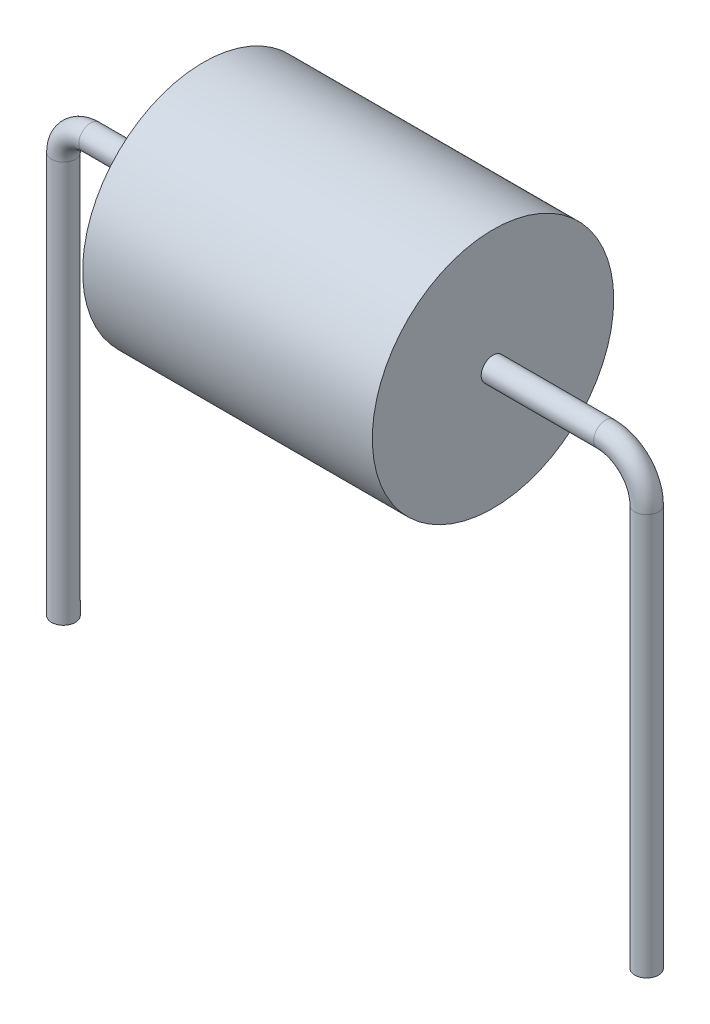
ISO-10303-21;
HEADER;
FILE_DESCRIPTION(('STEP AP214'),'2;1');
FILE_NAME('part.step','',(''),(''),'','','');
FILE_SCHEMA(('AUTOMOTIVE_DESIGN { 1 0 10303 214 1 1 1 1 }'));
ENDSEC;
DATA;
#1=APPLICATION_CONTEXT('core data for automotive mechanical design processes');
#2=APPLICATION_PROTOCOL_DEFINITION('international standard','automotive_design',2000,#1);
#3=PRODUCT_CONTEXT('',#1,'mechanical');
#4=PRODUCT('Part','Part','',(#3));
#5=PRODUCT_RELATED_PRODUCT_CATEGORY('part','',(#4));
#6=PRODUCT_DEFINITION_FORMATION('','',#4);
#7=PRODUCT_DEFINITION_CONTEXT('part definition',#1,'design');
#8=PRODUCT_DEFINITION('design','',#6,#7);
#9=PRODUCT_DEFINITION_SHAPE('','',#8);
#10=(LENGTH_UNIT() NAMED_UNIT(*) SI_UNIT(.MILLI.,.METRE.));
#11=(NAMED_UNIT(*) PLANE_ANGLE_UNIT() SI_UNIT($,.RADIAN.));
#12=(NAMED_UNIT(*) SI_UNIT($,.STERADIAN.) SOLID_ANGLE_UNIT());
#13=UNCERTAINTY_MEASURE_WITH_UNIT(LENGTH_MEASURE(1.E-05),#10,'distance_accuracy_value','');
#14=(GEOMETRIC_REPRESENTATION_CONTEXT(3) GLOBAL_UNCERTAINTY_ASSIGNED_CONTEXT((#13)) GLOBAL_UNIT_ASSIGNED_CONTEXT((#10,
#11,#12)) REPRESENTATION_CONTEXT('',''));
#15=CARTESIAN_POINT('',(0.,0.,0.));
#16=DIRECTION('',(0.,0.,1.));
#17=DIRECTION('',(1.,0.,0.));
#18=AXIS2_PLACEMENT_3D('',#15,#16,#17);
#19=CARTESIAN_POINT('',(6.,0.,0.));
#20=DIRECTION('',(-1.,0.,0.));
#21=DIRECTION('',(0.,0.,1.));
#22=AXIS2_PLACEMENT_3D('',#19,#20,#21);
#23=CYLINDRICAL_SURFACE('',#22,2.5);
#24=CARTESIAN_POINT('',(6.,0.,0.));
#25=DIRECTION('',(1.,0.,0.));
#26=DIRECTION('',(0.,0.,-1.));
#27=AXIS2_PLACEMENT_3D('',#24,#25,#26);
#28=CIRCLE('',#27,2.5);
#29=CARTESIAN_POINT('',(6.,0.,-2.5));
#30=VERTEX_POINT('',#29);
#31=EDGE_CURVE('E40',#30,#30,#28,.T.);
#32=ORIENTED_EDGE('',*,*,#31,.F.);
#33=EDGE_LOOP('',(#32));
#34=FACE_BOUND('',#33,.T.);
#35=CARTESIAN_POINT('',(0.,0.,0.));
#36=DIRECTION('',(1.,0.,0.));
#37=DIRECTION('',(0.,0.,-1.));
#38=AXIS2_PLACEMENT_3D('',#35,#36,#37);
#39=CIRCLE('',#38,2.5);
#40=CARTESIAN_POINT('',(0.,0.,-2.5));
#41=VERTEX_POINT('',#40);
#42=EDGE_CURVE('E44',#41,#41,#39,.T.);
#43=ORIENTED_EDGE('',*,*,#42,.T.);
#44=EDGE_LOOP('',(#43));
#45=FACE_BOUND('',#44,.T.);
#46=ADVANCED_FACE('F34',(#34,#45),#23,.T.);
#47=CARTESIAN_POINT('',(6.,0.,0.));
#48=DIRECTION('',(1.,0.,0.));
#49=DIRECTION('',(0.,0.,-1.));
#50=AXIS2_PLACEMENT_3D('',#47,#48,#49);
#51=PLANE('',#50);
#52=CARTESIAN_POINT('',(6.,0.00240749528879376,0.));
#53=DIRECTION('',(1.,0.,0.));
#54=DIRECTION('',(0.,0.,-1.));
#55=AXIS2_PLACEMENT_3D('',#52,#53,#54);
#56=CIRCLE('',#55,0.244999999999999);
#57=CARTESIAN_POINT('',(6.,0.00240749528879376,-0.244999999999999));
#58=VERTEX_POINT('',#57);
#59=EDGE_CURVE('E10',#58,#58,#56,.T.);
#60=ORIENTED_EDGE('',*,*,#59,.F.);
#61=EDGE_LOOP('',(#60));
#62=FACE_BOUND('',#61,.T.);
#63=ORIENTED_EDGE('',*,*,#31,.T.);
#64=EDGE_LOOP('',(#63));
#65=FACE_BOUND('',#64,.T.);
#66=ADVANCED_FACE('F89',(#62,#65),#51,.T.);
#67=CARTESIAN_POINT('',(0.,0.,0.));
#68=DIRECTION('',(1.,0.,0.));
#69=DIRECTION('',(0.,0.,-1.));
#70=AXIS2_PLACEMENT_3D('',#67,#68,#69);
#71=PLANE('',#70);
#72=CARTESIAN_POINT('',(0.,-0.000978553572394958,0.));
#73=DIRECTION('',(-1.,0.,0.));
#74=DIRECTION('',(0.,-1.,0.));
#75=AXIS2_PLACEMENT_3D('',#72,#73,#74);
#76=CIRCLE('',#75,0.246458923714526);
#77=CARTESIAN_POINT('',(0.,-0.247437477286921,0.));
#78=VERTEX_POINT('',#77);
#79=EDGE_CURVE('E59',#78,#78,#76,.T.);
#80=ORIENTED_EDGE('',*,*,#79,.F.);
#81=EDGE_LOOP('',(#80));
#82=FACE_BOUND('',#81,.T.);
#83=ORIENTED_EDGE('',*,*,#42,.F.);
#84=EDGE_LOOP('',(#83));
#85=FACE_BOUND('',#84,.T.);
#86=ADVANCED_FACE('F94',(#82,#85),#71,.F.);
#87=CARTESIAN_POINT('',(-2.89719167684138,-8.87255809804059,0.));
#88=DIRECTION('',(0.,-1.,0.));
#89=DIRECTION('',(1.,0.,0.));
#90=AXIS2_PLACEMENT_3D('',#87,#88,#89);
#91=PLANE('',#90);
#92=CARTESIAN_POINT('',(-2.89719167684138,-8.87255809804059,0.));
#93=DIRECTION('',(0.,-1.,0.));
#94=DIRECTION('',(1.,0.,0.));
#95=AXIS2_PLACEMENT_3D('',#92,#93,#94);
#96=CIRCLE('',#95,0.246458923714526);
#97=CARTESIAN_POINT('',(-2.65073275312686,-8.87255809804059,0.));
#98=VERTEX_POINT('',#97);
#99=EDGE_CURVE('E49',#98,#98,#96,.T.);
#100=ORIENTED_EDGE('',*,*,#99,.T.);
#101=EDGE_LOOP('',(#100));
#102=FACE_BOUND('',#101,.T.);
#103=ADVANCED_FACE('F101',(#102),#91,.T.);
#104=CARTESIAN_POINT('',(0.,-0.000978553572394958,0.));
#105=DIRECTION('',(-1.,0.,0.));
#106=DIRECTION('',(0.,0.,1.));
#107=AXIS2_PLACEMENT_3D('',#104,#105,#106);
#108=CYLINDRICAL_SURFACE('',#107,0.246458923714526);
#109=CARTESIAN_POINT('',(-2.33257059002755,-0.000978553572394958,0.));
#110=DIRECTION('',(-1.,0.,0.));
#111=DIRECTION('',(0.,-1.,0.));
#112=AXIS2_PLACEMENT_3D('',#109,#110,#111);
#113=CIRCLE('',#112,0.246458923714526);
#114=CARTESIAN_POINT('',(-2.33257059002754,0.245480370142131,0.));
#115=VERTEX_POINT('',#114);
#116=EDGE_CURVE('E56',#115,#115,#113,.T.);
#117=ORIENTED_EDGE('',*,*,#116,.F.);
#118=EDGE_LOOP('',(#117));
#119=FACE_BOUND('',#118,.T.);
#120=ORIENTED_EDGE('',*,*,#79,.T.);
#121=EDGE_LOOP('',(#120));
#122=FACE_BOUND('',#121,.T.);
#123=ADVANCED_FACE('F106',(#119,#122),#108,.T.);
#124=CARTESIAN_POINT('',(-2.33257059002755,-0.565599640386232,0.));
#125=DIRECTION('',(0.,0.,1.));
#126=DIRECTION('',(1.,0.,0.));
#127=AXIS2_PLACEMENT_3D('',#124,#125,#126);
#128=TOROIDAL_SURFACE('',#127,0.564621086813837,0.246458923714526);
#129=CARTESIAN_POINT('',(-2.89719167684138,-0.565599640386232,0.));
#130=DIRECTION('',(0.,-1.,0.));
#131=DIRECTION('',(1.,0.,0.));
#132=AXIS2_PLACEMENT_3D('',#129,#130,#131);
#133=CIRCLE('',#132,0.246458923714526);
#134=CARTESIAN_POINT('',(-3.14365060055591,-0.565599640386232,0.));
#135=VERTEX_POINT('',#134);
#136=EDGE_CURVE('E53',#135,#135,#133,.T.);
#137=CARTESIAN_POINT('',(-2.33257059002755,-0.565599640386232,0.));
#138=DIRECTION('',(0.,0.,1.));
#139=DIRECTION('',(1.,0.,0.));
#140=AXIS2_PLACEMENT_3D('',#137,#138,#139);
#141=CIRCLE('',#140,0.811080010528364);
#142=EDGE_CURVE('',#115,#135,#141,.T.);
#143=ORIENTED_EDGE('',*,*,#116,.T.);
#144=ORIENTED_EDGE('',*,*,#136,.F.);
#145=ORIENTED_EDGE('',*,*,#142,.T.);
#146=ORIENTED_EDGE('',*,*,#142,.F.);
#147=EDGE_LOOP('',(#143,#145,#144,#146));
#148=FACE_BOUND('',#147,.T.);
#149=ADVANCED_FACE('F111',(#148),#128,.T.);
#150=CARTESIAN_POINT('',(-2.89719167684138,-0.565599640386232,0.));
#151=DIRECTION('',(0.,-1.,0.));
#152=DIRECTION('',(1.,0.,0.));
#153=AXIS2_PLACEMENT_3D('',#150,#151,#152);
#154=CYLINDRICAL_SURFACE('',#153,0.246458923714526);
#155=ORIENTED_EDGE('',*,*,#99,.F.);
#156=EDGE_LOOP('',(#155));
#157=FACE_BOUND('',#156,.T.);
#158=ORIENTED_EDGE('',*,*,#136,.T.);
#159=EDGE_LOOP('',(#158));
#160=FACE_BOUND('',#159,.T.);
#161=ADVANCED_FACE('F85',(#157,#160),#154,.T.);
#162=CARTESIAN_POINT('',(9.1824074952888,-9.16,0.));
#163=DIRECTION('',(0.,-1.,0.));
#164=DIRECTION('',(1.,0.,0.));
#165=AXIS2_PLACEMENT_3D('',#162,#163,#164);
#166=PLANE('',#165);
#167=CARTESIAN_POINT('',(9.1824074952888,-9.16,0.));
#168=DIRECTION('',(0.,-1.,0.));
#169=DIRECTION('',(1.,0.,0.));
#170=AXIS2_PLACEMENT_3D('',#167,#168,#169);
#171=CIRCLE('',#170,0.244999999999999);
#172=CARTESIAN_POINT('',(9.4274074952888,-9.16,0.));
#173=VERTEX_POINT('',#172);
#174=EDGE_CURVE('E62',#173,#173,#171,.T.);
#175=ORIENTED_EDGE('',*,*,#174,.T.);
#176=EDGE_LOOP('',(#175));
#177=FACE_BOUND('',#176,.T.);
#178=ADVANCED_FACE('F76',(#177),#166,.T.);
#179=CARTESIAN_POINT('',(6.,0.00240749528879376,0.));
#180=DIRECTION('',(1.,0.,0.));
#181=DIRECTION('',(0.,0.,-1.));
#182=AXIS2_PLACEMENT_3D('',#179,#180,#181);
#183=CYLINDRICAL_SURFACE('',#182,0.244999999999999);
#184=CARTESIAN_POINT('',(8.33,0.00240749528879376,0.));
#185=DIRECTION('',(1.,0.,0.));
#186=DIRECTION('',(0.,1.,0.));
#187=AXIS2_PLACEMENT_3D('',#184,#185,#186);
#188=CIRCLE('',#187,0.244999999999999);
#189=CARTESIAN_POINT('',(8.33,0.247407495288793,0.));
#190=VERTEX_POINT('',#189);
#191=EDGE_CURVE('E68',#190,#190,#188,.T.);
#192=ORIENTED_EDGE('',*,*,#191,.F.);
#193=EDGE_LOOP('',(#192));
#194=FACE_BOUND('',#193,.T.);
#195=ORIENTED_EDGE('',*,*,#59,.T.);
#196=EDGE_LOOP('',(#195));
#197=FACE_BOUND('',#196,.T.);
#198=ADVANCED_FACE('F74',(#194,#197),#183,.T.);
#199=CARTESIAN_POINT('',(8.33,-0.85,0.));
#200=DIRECTION('',(0.,0.,-1.));
#201=DIRECTION('',(-1.,0.,0.));
#202=AXIS2_PLACEMENT_3D('',#199,#200,#201);
#203=TOROIDAL_SURFACE('',#202,0.852407495288794,0.244999999999999);
#204=CARTESIAN_POINT('',(9.1824074952888,-0.849999999999995,0.));
#205=DIRECTION('',(0.,-1.,0.));
#206=DIRECTION('',(1.,0.,0.));
#207=AXIS2_PLACEMENT_3D('',#204,#205,#206);
#208=CIRCLE('',#207,0.244999999999999);
#209=CARTESIAN_POINT('',(9.42740749528879,-0.849999999999993,0.));
#210=VERTEX_POINT('',#209);
#211=EDGE_CURVE('E65',#210,#210,#208,.T.);
#212=CARTESIAN_POINT('',(8.33,-0.85,0.));
#213=DIRECTION('',(0.,0.,-1.));
#214=DIRECTION('',(-1.,0.,0.));
#215=AXIS2_PLACEMENT_3D('',#212,#213,#214);
#216=CIRCLE('',#215,1.09740749528879);
#217=EDGE_CURVE('',#190,#210,#216,.T.);
#218=ORIENTED_EDGE('',*,*,#191,.T.);
#219=ORIENTED_EDGE('',*,*,#211,.F.);
#220=ORIENTED_EDGE('',*,*,#217,.T.);
#221=ORIENTED_EDGE('',*,*,#217,.F.);
#222=EDGE_LOOP('',(#218,#220,#219,#221));
#223=FACE_BOUND('',#222,.T.);
#224=ADVANCED_FACE('F72',(#223),#203,.T.);
#225=CARTESIAN_POINT('',(9.18240749528879,-0.85,0.));
#226=DIRECTION('',(0.,-1.,0.));
#227=DIRECTION('',(1.,0.,0.));
#228=AXIS2_PLACEMENT_3D('',#225,#226,#227);
#229=CYLINDRICAL_SURFACE('',#228,0.244999999999999);
#230=ORIENTED_EDGE('',*,*,#174,.F.);
#231=EDGE_LOOP('',(#230));
#232=FACE_BOUND('',#231,.T.);
#233=ORIENTED_EDGE('',*,*,#211,.T.);
#234=EDGE_LOOP('',(#233));
#235=FACE_BOUND('',#234,.T.);
#236=ADVANCED_FACE('F82',(#232,#235),#229,.T.);
#237=CLOSED_SHELL('',(#46,#66,#86,#103,#123,#149,#161,#178,#198,#224,#236));
#238=MANIFOLD_SOLID_BREP('B2',#237);
#239=ADVANCED_BREP_SHAPE_REPRESENTATION('',(#18,#238),#14);
#240=SHAPE_DEFINITION_REPRESENTATION(#9,#239);
ENDSEC;
END-ISO-10303-21;
